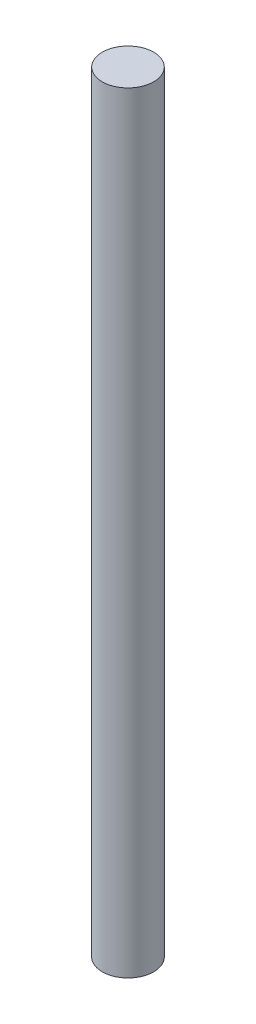
ISO-10303-21;
HEADER;
FILE_DESCRIPTION(('STEP AP214'),'2;1');
FILE_NAME('part.step','',(''),(''),'','','');
FILE_SCHEMA(('AUTOMOTIVE_DESIGN { 1 0 10303 214 1 1 1 1 }'));
ENDSEC;
DATA;
#1=APPLICATION_CONTEXT('core data for automotive mechanical design processes');
#2=APPLICATION_PROTOCOL_DEFINITION('international standard','automotive_design',2000,#1);
#3=PRODUCT_CONTEXT('',#1,'mechanical');
#4=PRODUCT('Part','Part','',(#3));
#5=PRODUCT_RELATED_PRODUCT_CATEGORY('part','',(#4));
#6=PRODUCT_DEFINITION_FORMATION('','',#4);
#7=PRODUCT_DEFINITION_CONTEXT('part definition',#1,'design');
#8=PRODUCT_DEFINITION('design','',#6,#7);
#9=PRODUCT_DEFINITION_SHAPE('','',#8);
#10=(LENGTH_UNIT() NAMED_UNIT(*) SI_UNIT(.MILLI.,.METRE.));
#11=(NAMED_UNIT(*) PLANE_ANGLE_UNIT() SI_UNIT($,.RADIAN.));
#12=(NAMED_UNIT(*) SI_UNIT($,.STERADIAN.) SOLID_ANGLE_UNIT());
#13=UNCERTAINTY_MEASURE_WITH_UNIT(LENGTH_MEASURE(1.E-05),#10,'distance_accuracy_value','');
#14=(GEOMETRIC_REPRESENTATION_CONTEXT(3) GLOBAL_UNCERTAINTY_ASSIGNED_CONTEXT((#13)) GLOBAL_UNIT_ASSIGNED_CONTEXT((#10,
#11,#12)) REPRESENTATION_CONTEXT('',''));
#15=CARTESIAN_POINT('',(0.,0.,0.));
#16=DIRECTION('',(0.,0.,1.));
#17=DIRECTION('',(1.,0.,0.));
#18=AXIS2_PLACEMENT_3D('',#15,#16,#17);
#19=CARTESIAN_POINT('',(0.,150.,0.));
#20=DIRECTION('',(0.,-1.,0.));
#21=DIRECTION('',(0.,0.,-1.));
#22=AXIS2_PLACEMENT_3D('',#19,#20,#21);
#23=CYLINDRICAL_SURFACE('',#22,5.);
#24=CARTESIAN_POINT('',(0.,150.,0.));
#25=DIRECTION('',(0.,1.,0.));
#26=DIRECTION('',(0.,0.,1.));
#27=AXIS2_PLACEMENT_3D('',#24,#25,#26);
#28=CIRCLE('',#27,5.);
#29=CARTESIAN_POINT('',(0.,150.,5.));
#30=VERTEX_POINT('',#29);
#31=EDGE_CURVE('E10',#30,#30,#28,.T.);
#32=ORIENTED_EDGE('',*,*,#31,.F.);
#33=EDGE_LOOP('',(#32));
#34=FACE_BOUND('',#33,.T.);
#35=CARTESIAN_POINT('',(0.,0.,0.));
#36=DIRECTION('',(0.,1.,0.));
#37=DIRECTION('',(0.,0.,1.));
#38=AXIS2_PLACEMENT_3D('',#35,#36,#37);
#39=CIRCLE('',#38,5.);
#40=CARTESIAN_POINT('',(0.,0.,5.));
#41=VERTEX_POINT('',#40);
#42=EDGE_CURVE('E44',#41,#41,#39,.T.);
#43=ORIENTED_EDGE('',*,*,#42,.T.);
#44=EDGE_LOOP('',(#43));
#45=FACE_BOUND('',#44,.T.);
#46=ADVANCED_FACE('F41',(#34,#45),#23,.T.);
#47=CARTESIAN_POINT('',(0.,150.,0.));
#48=DIRECTION('',(0.,1.,0.));
#49=DIRECTION('',(0.,0.,1.));
#50=AXIS2_PLACEMENT_3D('',#47,#48,#49);
#51=PLANE('',#50);
#52=ORIENTED_EDGE('',*,*,#31,.T.);
#53=EDGE_LOOP('',(#52));
#54=FACE_BOUND('',#53,.T.);
#55=ADVANCED_FACE('F56',(#54),#51,.T.);
#56=CARTESIAN_POINT('',(0.,0.,0.));
#57=DIRECTION('',(0.,1.,0.));
#58=DIRECTION('',(0.,0.,1.));
#59=AXIS2_PLACEMENT_3D('',#56,#57,#58);
#60=PLANE('',#59);
#61=ORIENTED_EDGE('',*,*,#42,.F.);
#62=EDGE_LOOP('',(#61));
#63=FACE_BOUND('',#62,.T.);
#64=ADVANCED_FACE('F54',(#63),#60,.F.);
#65=CLOSED_SHELL('',(#46,#55,#64));
#66=MANIFOLD_SOLID_BREP('B2',#65);
#67=ADVANCED_BREP_SHAPE_REPRESENTATION('',(#18,#66),#14);
#68=SHAPE_DEFINITION_REPRESENTATION(#9,#67);
ENDSEC;
END-ISO-10303-21;
